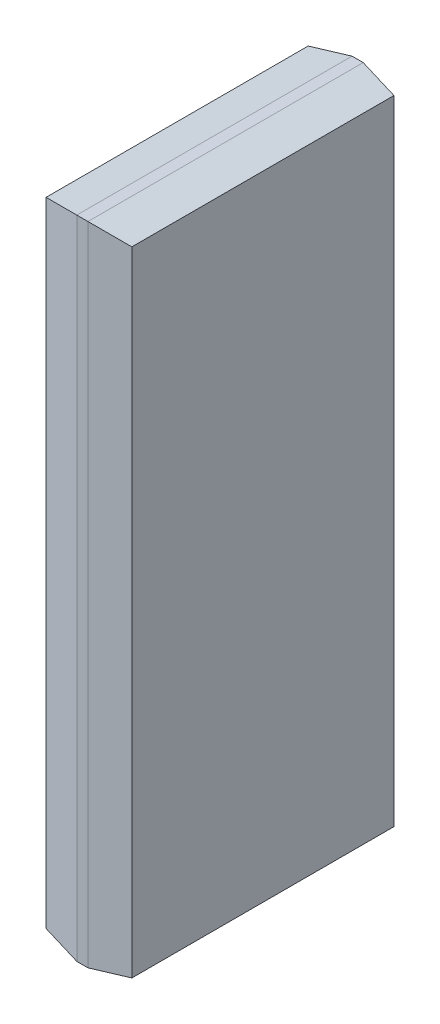
ISO-10303-21;
HEADER;
FILE_DESCRIPTION(('STEP AP214'),'2;1');
FILE_NAME('part.step','',(''),(''),'','','');
FILE_SCHEMA(('AUTOMOTIVE_DESIGN { 1 0 10303 214 1 1 1 1 }'));
ENDSEC;
DATA;
#1=APPLICATION_CONTEXT('core data for automotive mechanical design processes');
#2=APPLICATION_PROTOCOL_DEFINITION('international standard','automotive_design',2000,#1);
#3=PRODUCT_CONTEXT('',#1,'mechanical');
#4=PRODUCT('Part','Part','',(#3));
#5=PRODUCT_RELATED_PRODUCT_CATEGORY('part','',(#4));
#6=PRODUCT_DEFINITION_FORMATION('','',#4);
#7=PRODUCT_DEFINITION_CONTEXT('part definition',#1,'design');
#8=PRODUCT_DEFINITION('design','',#6,#7);
#9=PRODUCT_DEFINITION_SHAPE('','',#8);
#10=(LENGTH_UNIT() NAMED_UNIT(*) SI_UNIT(.MILLI.,.METRE.));
#11=(NAMED_UNIT(*) PLANE_ANGLE_UNIT() SI_UNIT($,.RADIAN.));
#12=(NAMED_UNIT(*) SI_UNIT($,.STERADIAN.) SOLID_ANGLE_UNIT());
#13=UNCERTAINTY_MEASURE_WITH_UNIT(LENGTH_MEASURE(1.E-05),#10,'distance_accuracy_value','');
#14=(GEOMETRIC_REPRESENTATION_CONTEXT(3) GLOBAL_UNCERTAINTY_ASSIGNED_CONTEXT((#13)) GLOBAL_UNIT_ASSIGNED_CONTEXT((#10,
#11,#12)) REPRESENTATION_CONTEXT('',''));
#15=CARTESIAN_POINT('',(0.,0.,0.));
#16=DIRECTION('',(0.,0.,1.));
#17=DIRECTION('',(1.,0.,0.));
#18=AXIS2_PLACEMENT_3D('',#15,#16,#17);
#19=CARTESIAN_POINT('',(97.6307465104996,85.6106999991007,8.66496011499787));
#20=DIRECTION('',(1.,0.,0.));
#21=DIRECTION('',(0.,0.,-1.));
#22=AXIS2_PLACEMENT_3D('',#19,#20,#21);
#23=PLANE('',#22);
#24=DIRECTION('',(0.,0.,1.));
#25=VECTOR('',#24,1.);
#26=CARTESIAN_POINT('',(97.6307465104996,94.4323199391639,12.4999601149978));
#27=LINE('',#26,#25);
#28=CARTESIAN_POINT('',(97.6307465104995,94.4323199391638,5.0133401749346));
#29=VERTEX_POINT('',#28);
#30=CARTESIAN_POINT('',(97.6307465104996,94.4323199391639,12.316580055061));
#31=VERTEX_POINT('',#30);
#32=EDGE_CURVE('E161',#29,#31,#27,.T.);
#33=ORIENTED_EDGE('',*,*,#32,.F.);
#34=DIRECTION('',(0.,1.,0.));
#35=VECTOR('',#34,1.);
#36=CARTESIAN_POINT('',(97.6307465104995,94.6156999991006,5.0133401749346));
#37=LINE('',#36,#35);
#38=CARTESIAN_POINT('',(97.6307465104996,76.7890800590374,5.01334017493478));
#39=VERTEX_POINT('',#38);
#40=EDGE_CURVE('E28',#39,#29,#37,.T.);
#41=ORIENTED_EDGE('',*,*,#40,.F.);
#42=DIRECTION('',(0.,0.,-1.));
#43=VECTOR('',#42,1.);
#44=CARTESIAN_POINT('',(97.6307465104996,76.7890800590374,4.82996011499798));
#45=LINE('',#44,#43);
#46=CARTESIAN_POINT('',(97.6307465104997,76.7890800590375,12.3165800550612));
#47=VERTEX_POINT('',#46);
#48=EDGE_CURVE('E11',#47,#39,#45,.T.);
#49=ORIENTED_EDGE('',*,*,#48,.F.);
#50=DIRECTION('',(0.,-1.,0.));
#51=VECTOR('',#50,1.);
#52=CARTESIAN_POINT('',(97.6307465104997,76.6056999991007,12.3165800550612));
#53=LINE('',#52,#51);
#54=EDGE_CURVE('E186',#31,#47,#53,.T.);
#55=ORIENTED_EDGE('',*,*,#54,.F.);
#56=EDGE_LOOP('',(#33,#41,#49,#55));
#57=FACE_BOUND('',#56,.T.);
#58=ADVANCED_FACE('F17',(#57),#23,.F.);
#59=CARTESIAN_POINT('',(98.6707465104996,76.6056999991006,4.82996011499797));
#60=DIRECTION('',(-0.173648177666926,-0.984807753012209,0.));
#61=DIRECTION('',(-0.984807753012209,0.173648177666926,0.));
#62=AXIS2_PLACEMENT_3D('',#59,#60,#61);
#63=PLANE('',#62);
#64=DIRECTION('',(0.970287525247817,-0.171087869746029,0.171087869746026));
#65=VECTOR('',#64,1.);
#66=CARTESIAN_POINT('',(98.6707465104997,76.6056999991007,12.499960114998));
#67=LINE('',#66,#65);
#68=CARTESIAN_POINT('',(98.6707465104997,76.6056999991007,12.499960114998));
#69=VERTEX_POINT('',#68);
#70=EDGE_CURVE('E217',#47,#69,#67,.T.);
#71=ORIENTED_EDGE('',*,*,#70,.F.);
#72=ORIENTED_EDGE('',*,*,#48,.T.);
#73=DIRECTION('',(0.970287525247813,-0.171087869746033,-0.171087869746046));
#74=VECTOR('',#73,1.);
#75=CARTESIAN_POINT('',(98.6707465104996,76.6056999991006,4.82996011499797));
#76=LINE('',#75,#74);
#77=CARTESIAN_POINT('',(98.6707465104996,76.6056999991006,4.82996011499797));
#78=VERTEX_POINT('',#77);
#79=EDGE_CURVE('E156',#39,#78,#76,.T.);
#80=ORIENTED_EDGE('',*,*,#79,.T.);
#81=DIRECTION('',(0.,0.,-1.));
#82=VECTOR('',#81,1.);
#83=CARTESIAN_POINT('',(98.6707465104996,76.6056999991006,4.82996011499797));
#84=LINE('',#83,#82);
#85=EDGE_CURVE('E143',#69,#78,#84,.T.);
#86=ORIENTED_EDGE('',*,*,#85,.F.);
#87=EDGE_LOOP('',(#71,#72,#80,#86));
#88=FACE_BOUND('',#87,.T.);
#89=ADVANCED_FACE('F240',(#88),#63,.T.);
#90=CARTESIAN_POINT('',(98.6707465104996,94.6156999991006,4.82996011499778));
#91=DIRECTION('',(-0.173648177666943,0.,-0.984807753012206));
#92=DIRECTION('',(-0.984807753012206,0.,0.173648177666943));
#93=AXIS2_PLACEMENT_3D('',#90,#91,#92);
#94=PLANE('',#93);
#95=ORIENTED_EDGE('',*,*,#79,.F.);
#96=ORIENTED_EDGE('',*,*,#40,.T.);
#97=DIRECTION('',(0.970287525247811,0.171087869746039,-0.17108786974605));
#98=VECTOR('',#97,1.);
#99=CARTESIAN_POINT('',(98.6707465104996,94.6156999991006,4.82996011499778));
#100=LINE('',#99,#98);
#101=CARTESIAN_POINT('',(98.6707465104996,94.6156999991006,4.82996011499778));
#102=VERTEX_POINT('',#101);
#103=EDGE_CURVE('E68',#29,#102,#100,.T.);
#104=ORIENTED_EDGE('',*,*,#103,.T.);
#105=DIRECTION('',(0.,1.,0.));
#106=VECTOR('',#105,1.);
#107=CARTESIAN_POINT('',(98.6707465104996,76.6056999991006,4.82996011499797));
#108=LINE('',#107,#106);
#109=EDGE_CURVE('E133',#78,#102,#108,.T.);
#110=ORIENTED_EDGE('',*,*,#109,.F.);
#111=EDGE_LOOP('',(#95,#96,#104,#110));
#112=FACE_BOUND('',#111,.T.);
#113=ADVANCED_FACE('F242',(#112),#94,.T.);
#114=CARTESIAN_POINT('',(98.6707465104996,94.6156999991007,12.4999601149978));
#115=DIRECTION('',(-0.173648177666936,0.984807753012207,0.));
#116=DIRECTION('',(0.,0.,1.));
#117=AXIS2_PLACEMENT_3D('',#114,#115,#116);
#118=PLANE('',#117);
#119=ORIENTED_EDGE('',*,*,#103,.F.);
#120=ORIENTED_EDGE('',*,*,#32,.T.);
#121=DIRECTION('',(0.970287525247815,0.171087869746043,0.171087869746022));
#122=VECTOR('',#121,1.);
#123=CARTESIAN_POINT('',(98.6707465104996,94.6156999991007,12.4999601149978));
#124=LINE('',#123,#122);
#125=CARTESIAN_POINT('',(98.6707465104996,94.6156999991007,12.4999601149978));
#126=VERTEX_POINT('',#125);
#127=EDGE_CURVE('E81',#31,#126,#124,.T.);
#128=ORIENTED_EDGE('',*,*,#127,.T.);
#129=DIRECTION('',(0.,0.,1.));
#130=VECTOR('',#129,1.);
#131=CARTESIAN_POINT('',(98.6707465104996,94.6156999991006,4.82996011499778));
#132=LINE('',#131,#130);
#133=EDGE_CURVE('E226',#102,#126,#132,.T.);
#134=ORIENTED_EDGE('',*,*,#133,.F.);
#135=EDGE_LOOP('',(#119,#120,#128,#134));
#136=FACE_BOUND('',#135,.T.);
#137=ADVANCED_FACE('F235',(#136),#118,.T.);
#138=CARTESIAN_POINT('',(98.6707465104997,76.6056999991007,12.499960114998));
#139=DIRECTION('',(-0.173648177666919,0.,0.98480775301221));
#140=DIRECTION('',(0.,1.,0.));
#141=AXIS2_PLACEMENT_3D('',#138,#139,#140);
#142=PLANE('',#141);
#143=ORIENTED_EDGE('',*,*,#127,.F.);
#144=ORIENTED_EDGE('',*,*,#54,.T.);
#145=ORIENTED_EDGE('',*,*,#70,.T.);
#146=DIRECTION('',(0.,-1.,0.));
#147=VECTOR('',#146,1.);
#148=CARTESIAN_POINT('',(98.6707465104997,76.6056999991007,12.499960114998));
#149=LINE('',#148,#147);
#150=EDGE_CURVE('E145',#126,#69,#149,.T.);
#151=ORIENTED_EDGE('',*,*,#150,.F.);
#152=EDGE_LOOP('',(#143,#144,#145,#151));
#153=FACE_BOUND('',#152,.T.);
#154=ADVANCED_FACE('F239',(#153),#142,.T.);
#155=CARTESIAN_POINT('',(100.0207465105,85.6106999991007,8.66496011499784));
#156=DIRECTION('',(1.,0.,0.));
#157=DIRECTION('',(0.,0.,-1.));
#158=AXIS2_PLACEMENT_3D('',#155,#156,#157);
#159=PLANE('',#158);
#160=DIRECTION('',(0.,1.,0.));
#161=VECTOR('',#160,1.);
#162=CARTESIAN_POINT('',(100.0207465105,76.6056999991006,5.01334017493476));
#163=LINE('',#162,#161);
#164=CARTESIAN_POINT('',(100.0207465105,76.7890800590374,5.01334017493476));
#165=VERTEX_POINT('',#164);
#166=CARTESIAN_POINT('',(100.0207465105,94.4323199391638,5.01334017493457));
#167=VERTEX_POINT('',#166);
#168=EDGE_CURVE('E192',#165,#167,#163,.T.);
#169=ORIENTED_EDGE('',*,*,#168,.T.);
#170=DIRECTION('',(0.,0.,1.));
#171=VECTOR('',#170,1.);
#172=CARTESIAN_POINT('',(100.0207465105,94.4323199391638,4.82996011499777));
#173=LINE('',#172,#171);
#174=CARTESIAN_POINT('',(100.0207465105,94.4323199391639,12.3165800550609));
#175=VERTEX_POINT('',#174);
#176=EDGE_CURVE('E121',#167,#175,#173,.T.);
#177=ORIENTED_EDGE('',*,*,#176,.T.);
#178=DIRECTION('',(0.,-1.,0.));
#179=VECTOR('',#178,1.);
#180=CARTESIAN_POINT('',(100.0207465105,94.6156999991007,12.3165800550609));
#181=LINE('',#180,#179);
#182=CARTESIAN_POINT('',(100.0207465105,76.7890800590375,12.3165800550611));
#183=VERTEX_POINT('',#182);
#184=EDGE_CURVE('E120',#175,#183,#181,.T.);
#185=ORIENTED_EDGE('',*,*,#184,.T.);
#186=DIRECTION('',(0.,0.,-1.));
#187=VECTOR('',#186,1.);
#188=CARTESIAN_POINT('',(100.0207465105,76.7890800590375,12.4999601149979));
#189=LINE('',#188,#187);
#190=EDGE_CURVE('E115',#183,#165,#189,.T.);
#191=ORIENTED_EDGE('',*,*,#190,.T.);
#192=EDGE_LOOP('',(#169,#177,#185,#191));
#193=FACE_BOUND('',#192,.T.);
#194=ADVANCED_FACE('F190',(#193),#159,.T.);
#195=CARTESIAN_POINT('',(98.9807465104997,76.6056999991007,12.4999601149979));
#196=DIRECTION('',(0.173648177666936,-0.984807753012207,0.));
#197=DIRECTION('',(0.,0.,-1.));
#198=AXIS2_PLACEMENT_3D('',#195,#196,#197);
#199=PLANE('',#198);
#200=DIRECTION('',(0.,0.,-1.));
#201=VECTOR('',#200,1.);
#202=CARTESIAN_POINT('',(98.9807465104997,76.6056999991006,4.82996011499797));
#203=LINE('',#202,#201);
#204=CARTESIAN_POINT('',(98.9807465104997,76.6056999991007,12.4999601149979));
#205=VERTEX_POINT('',#204);
#206=CARTESIAN_POINT('',(98.9807465104997,76.6056999991006,4.82996011499797));
#207=VERTEX_POINT('',#206);
#208=EDGE_CURVE('E112',#205,#207,#203,.T.);
#209=ORIENTED_EDGE('',*,*,#208,.T.);
#210=DIRECTION('',(-0.970287525247815,-0.171087869746043,-0.171087869746022));
#211=VECTOR('',#210,1.);
#212=CARTESIAN_POINT('',(98.9807465104997,76.6056999991006,4.82996011499797));
#213=LINE('',#212,#211);
#214=EDGE_CURVE('E200',#165,#207,#213,.T.);
#215=ORIENTED_EDGE('',*,*,#214,.F.);
#216=ORIENTED_EDGE('',*,*,#190,.F.);
#217=DIRECTION('',(-0.970287525247811,-0.171087869746039,0.17108786974605));
#218=VECTOR('',#217,1.);
#219=CARTESIAN_POINT('',(98.9807465104997,76.6056999991007,12.4999601149979));
#220=LINE('',#219,#218);
#221=EDGE_CURVE('E108',#183,#205,#220,.T.);
#222=ORIENTED_EDGE('',*,*,#221,.T.);
#223=EDGE_LOOP('',(#209,#215,#216,#222));
#224=FACE_BOUND('',#223,.T.);
#225=ADVANCED_FACE('F110',(#224),#199,.T.);
#226=CARTESIAN_POINT('',(98.9807465104997,94.6156999991007,12.4999601149978));
#227=DIRECTION('',(0.173648177666943,0.,0.984807753012206));
#228=DIRECTION('',(0.,-1.,0.));
#229=AXIS2_PLACEMENT_3D('',#226,#227,#228);
#230=PLANE('',#229);
#231=DIRECTION('',(0.,-1.,0.));
#232=VECTOR('',#231,1.);
#233=CARTESIAN_POINT('',(98.9807465104997,76.6056999991007,12.4999601149979));
#234=LINE('',#233,#232);
#235=CARTESIAN_POINT('',(98.9807465104997,94.6156999991007,12.4999601149978));
#236=VERTEX_POINT('',#235);
#237=EDGE_CURVE('E21',#236,#205,#234,.T.);
#238=ORIENTED_EDGE('',*,*,#237,.T.);
#239=ORIENTED_EDGE('',*,*,#221,.F.);
#240=ORIENTED_EDGE('',*,*,#184,.F.);
#241=DIRECTION('',(-0.970287525247813,0.171087869746033,0.171087869746046));
#242=VECTOR('',#241,1.);
#243=CARTESIAN_POINT('',(98.9807465104997,94.6156999991007,12.4999601149978));
#244=LINE('',#243,#242);
#245=EDGE_CURVE('E138',#175,#236,#244,.T.);
#246=ORIENTED_EDGE('',*,*,#245,.T.);
#247=EDGE_LOOP('',(#238,#239,#240,#246));
#248=FACE_BOUND('',#247,.T.);
#249=ADVANCED_FACE('F136',(#248),#230,.T.);
#250=CARTESIAN_POINT('',(98.9807465104995,94.6156999991006,4.82996011499778));
#251=DIRECTION('',(0.173648177666926,0.984807753012209,0.));
#252=DIRECTION('',(0.,0.,-1.));
#253=AXIS2_PLACEMENT_3D('',#250,#251,#252);
#254=PLANE('',#253);
#255=DIRECTION('',(0.,0.,1.));
#256=VECTOR('',#255,1.);
#257=CARTESIAN_POINT('',(98.9807465104995,94.6156999991006,4.82996011499778));
#258=LINE('',#257,#256);
#259=CARTESIAN_POINT('',(98.9807465104995,94.6156999991006,4.82996011499778));
#260=VERTEX_POINT('',#259);
#261=EDGE_CURVE('E180',#260,#236,#258,.T.);
#262=ORIENTED_EDGE('',*,*,#261,.T.);
#263=ORIENTED_EDGE('',*,*,#245,.F.);
#264=ORIENTED_EDGE('',*,*,#176,.F.);
#265=DIRECTION('',(-0.970287525247817,0.171087869746029,-0.171087869746026));
#266=VECTOR('',#265,1.);
#267=CARTESIAN_POINT('',(98.9807465104995,94.6156999991006,4.82996011499778));
#268=LINE('',#267,#266);
#269=EDGE_CURVE('E174',#167,#260,#268,.T.);
#270=ORIENTED_EDGE('',*,*,#269,.T.);
#271=EDGE_LOOP('',(#262,#263,#264,#270));
#272=FACE_BOUND('',#271,.T.);
#273=ADVANCED_FACE('F196',(#272),#254,.T.);
#274=CARTESIAN_POINT('',(98.9807465104997,76.6056999991006,4.82996011499797));
#275=DIRECTION('',(0.173648177666919,0.,-0.98480775301221));
#276=DIRECTION('',(0.,-1.,0.));
#277=AXIS2_PLACEMENT_3D('',#274,#275,#276);
#278=PLANE('',#277);
#279=DIRECTION('',(0.,1.,0.));
#280=VECTOR('',#279,1.);
#281=CARTESIAN_POINT('',(98.9807465104997,76.6056999991006,4.82996011499797));
#282=LINE('',#281,#280);
#283=EDGE_CURVE('E172',#207,#260,#282,.T.);
#284=ORIENTED_EDGE('',*,*,#283,.T.);
#285=ORIENTED_EDGE('',*,*,#269,.F.);
#286=ORIENTED_EDGE('',*,*,#168,.F.);
#287=ORIENTED_EDGE('',*,*,#214,.T.);
#288=EDGE_LOOP('',(#284,#285,#286,#287));
#289=FACE_BOUND('',#288,.T.);
#290=ADVANCED_FACE('F258',(#289),#278,.T.);
#291=CARTESIAN_POINT('',(98.9807465104997,76.6056999991006,4.82996011499797));
#292=DIRECTION('',(0.,0.,1.));
#293=DIRECTION('',(1.,0.,0.));
#294=AXIS2_PLACEMENT_3D('',#291,#292,#293);
#295=PLANE('',#294);
#296=ORIENTED_EDGE('',*,*,#109,.T.);
#297=DIRECTION('',(-1.,0.,0.));
#298=VECTOR('',#297,1.);
#299=CARTESIAN_POINT('',(98.9807465104995,94.6156999991006,4.82996011499778));
#300=LINE('',#299,#298);
#301=EDGE_CURVE('E151',#260,#102,#300,.T.);
#302=ORIENTED_EDGE('',*,*,#301,.F.);
#303=ORIENTED_EDGE('',*,*,#283,.F.);
#304=DIRECTION('',(-1.,0.,0.));
#305=VECTOR('',#304,1.);
#306=CARTESIAN_POINT('',(98.9807465104997,76.6056999991006,4.82996011499797));
#307=LINE('',#306,#305);
#308=EDGE_CURVE('E131',#207,#78,#307,.T.);
#309=ORIENTED_EDGE('',*,*,#308,.T.);
#310=EDGE_LOOP('',(#296,#302,#303,#309));
#311=FACE_BOUND('',#310,.T.);
#312=ADVANCED_FACE('F19',(#311),#295,.F.);
#313=CARTESIAN_POINT('',(98.9807465104997,76.6056999991006,4.82996011499797));
#314=DIRECTION('',(0.,1.,0.));
#315=DIRECTION('',(0.,0.,-1.));
#316=AXIS2_PLACEMENT_3D('',#313,#314,#315);
#317=PLANE('',#316);
#318=ORIENTED_EDGE('',*,*,#85,.T.);
#319=ORIENTED_EDGE('',*,*,#308,.F.);
#320=ORIENTED_EDGE('',*,*,#208,.F.);
#321=DIRECTION('',(-1.,0.,0.));
#322=VECTOR('',#321,1.);
#323=CARTESIAN_POINT('',(98.9807465104997,76.6056999991007,12.4999601149979));
#324=LINE('',#323,#322);
#325=EDGE_CURVE('E128',#205,#69,#324,.T.);
#326=ORIENTED_EDGE('',*,*,#325,.T.);
#327=EDGE_LOOP('',(#318,#319,#320,#326));
#328=FACE_BOUND('',#327,.T.);
#329=ADVANCED_FACE('F126',(#328),#317,.F.);
#330=CARTESIAN_POINT('',(98.9807465104997,76.6056999991007,12.4999601149979));
#331=DIRECTION('',(0.,0.,-1.));
#332=DIRECTION('',(-1.,0.,0.));
#333=AXIS2_PLACEMENT_3D('',#330,#331,#332);
#334=PLANE('',#333);
#335=ORIENTED_EDGE('',*,*,#150,.T.);
#336=ORIENTED_EDGE('',*,*,#325,.F.);
#337=ORIENTED_EDGE('',*,*,#237,.F.);
#338=DIRECTION('',(-1.,0.,0.));
#339=VECTOR('',#338,1.);
#340=CARTESIAN_POINT('',(98.9807465104997,94.6156999991007,12.4999601149978));
#341=LINE('',#340,#339);
#342=EDGE_CURVE('E223',#236,#126,#341,.T.);
#343=ORIENTED_EDGE('',*,*,#342,.T.);
#344=EDGE_LOOP('',(#335,#336,#337,#343));
#345=FACE_BOUND('',#344,.T.);
#346=ADVANCED_FACE('F144',(#345),#334,.F.);
#347=CARTESIAN_POINT('',(98.9807465104995,94.6156999991006,4.82996011499778));
#348=DIRECTION('',(0.,-1.,0.));
#349=DIRECTION('',(-1.,0.,0.));
#350=AXIS2_PLACEMENT_3D('',#347,#348,#349);
#351=PLANE('',#350);
#352=ORIENTED_EDGE('',*,*,#133,.T.);
#353=ORIENTED_EDGE('',*,*,#342,.F.);
#354=ORIENTED_EDGE('',*,*,#261,.F.);
#355=ORIENTED_EDGE('',*,*,#301,.T.);
#356=EDGE_LOOP('',(#352,#353,#354,#355));
#357=FACE_BOUND('',#356,.T.);
#358=ADVANCED_FACE('F233',(#357),#351,.F.);
#359=CLOSED_SHELL('',(#58,#89,#113,#137,#154,#194,#225,#249,#273,#290,#312,#329,#346,#358));
#360=MANIFOLD_SOLID_BREP('B1',#359);
#361=ADVANCED_BREP_SHAPE_REPRESENTATION('',(#18,#360),#14);
#362=SHAPE_DEFINITION_REPRESENTATION(#9,#361);
ENDSEC;
END-ISO-10303-21;
